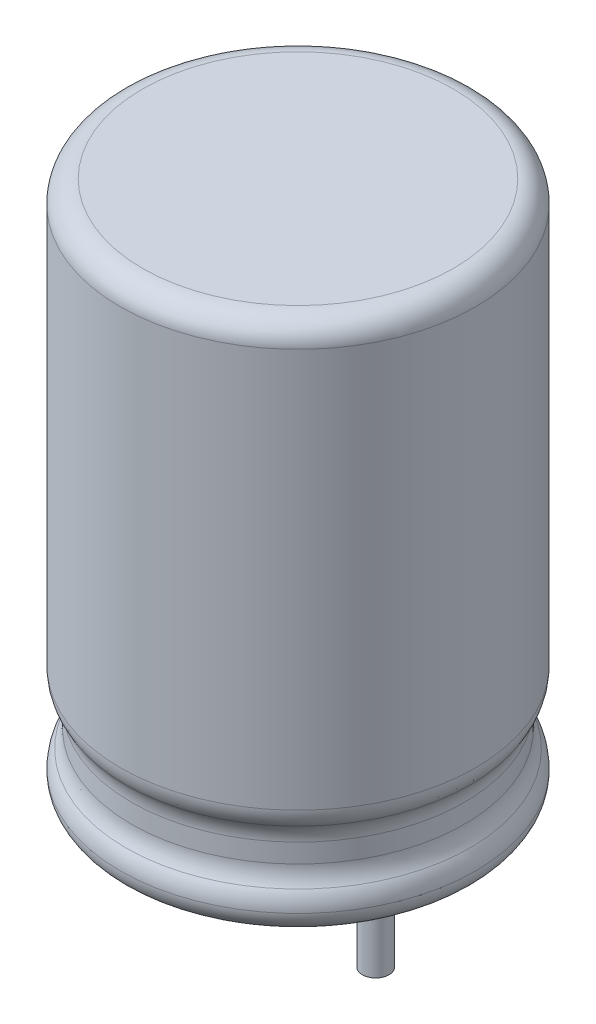
ISO-10303-21;
HEADER;
FILE_DESCRIPTION(('STEP AP214'),'2;1');
FILE_NAME('part.step','',(''),(''),'','','');
FILE_SCHEMA(('AUTOMOTIVE_DESIGN { 1 0 10303 214 1 1 1 1 }'));
ENDSEC;
DATA;
#1=APPLICATION_CONTEXT('core data for automotive mechanical design processes');
#2=APPLICATION_PROTOCOL_DEFINITION('international standard','automotive_design',2000,#1);
#3=PRODUCT_CONTEXT('',#1,'mechanical');
#4=PRODUCT('Part','Part','',(#3));
#5=PRODUCT_RELATED_PRODUCT_CATEGORY('part','',(#4));
#6=PRODUCT_DEFINITION_FORMATION('','',#4);
#7=PRODUCT_DEFINITION_CONTEXT('part definition',#1,'design');
#8=PRODUCT_DEFINITION('design','',#6,#7);
#9=PRODUCT_DEFINITION_SHAPE('','',#8);
#10=(LENGTH_UNIT() NAMED_UNIT(*) SI_UNIT(.MILLI.,.METRE.));
#11=(NAMED_UNIT(*) PLANE_ANGLE_UNIT() SI_UNIT($,.RADIAN.));
#12=(NAMED_UNIT(*) SI_UNIT($,.STERADIAN.) SOLID_ANGLE_UNIT());
#13=UNCERTAINTY_MEASURE_WITH_UNIT(LENGTH_MEASURE(1.E-05),#10,'distance_accuracy_value','');
#14=(GEOMETRIC_REPRESENTATION_CONTEXT(3) GLOBAL_UNCERTAINTY_ASSIGNED_CONTEXT((#13)) GLOBAL_UNIT_ASSIGNED_CONTEXT((#10,
#11,#12)) REPRESENTATION_CONTEXT('',''));
#15=CARTESIAN_POINT('',(0.,0.,0.));
#16=DIRECTION('',(0.,0.,1.));
#17=DIRECTION('',(1.,0.,0.));
#18=AXIS2_PLACEMENT_3D('',#15,#16,#17);
#19=CARTESIAN_POINT('',(0.,0.,0.));
#20=DIRECTION('',(0.,1.,0.));
#21=DIRECTION('',(0.,0.,1.));
#22=AXIS2_PLACEMENT_3D('',#19,#20,#21);
#23=PLANE('',#22);
#24=CARTESIAN_POINT('',(-1.75,0.,0.));
#25=DIRECTION('',(0.,1.,0.));
#26=DIRECTION('',(0.,0.,1.));
#27=AXIS2_PLACEMENT_3D('',#24,#25,#26);
#28=CIRCLE('',#27,0.3);
#29=CARTESIAN_POINT('',(-1.75,0.,0.3));
#30=VERTEX_POINT('',#29);
#31=EDGE_CURVE('E47',#30,#30,#28,.F.);
#32=ORIENTED_EDGE('',*,*,#31,.F.);
#33=EDGE_LOOP('',(#32));
#34=FACE_BOUND('',#33,.T.);
#35=CARTESIAN_POINT('',(0.,0.,0.));
#36=DIRECTION('',(0.,1.,0.));
#37=DIRECTION('',(0.,0.,1.));
#38=AXIS2_PLACEMENT_3D('',#35,#36,#37);
#39=CIRCLE('',#38,3.5);
#40=CARTESIAN_POINT('',(0.,0.,3.5));
#41=VERTEX_POINT('',#40);
#42=EDGE_CURVE('E193',#41,#41,#39,.F.);
#43=ORIENTED_EDGE('',*,*,#42,.T.);
#44=EDGE_LOOP('',(#43));
#45=FACE_BOUND('',#44,.T.);
#46=CARTESIAN_POINT('',(1.75,0.,0.));
#47=DIRECTION('',(0.,1.,0.));
#48=DIRECTION('',(0.,0.,1.));
#49=AXIS2_PLACEMENT_3D('',#46,#47,#48);
#50=CIRCLE('',#49,0.3);
#51=CARTESIAN_POINT('',(1.75,0.,0.300000000000001));
#52=VERTEX_POINT('',#51);
#53=EDGE_CURVE('E11',#52,#52,#50,.F.);
#54=ORIENTED_EDGE('',*,*,#53,.F.);
#55=EDGE_LOOP('',(#54));
#56=FACE_BOUND('',#55,.T.);
#57=ADVANCED_FACE('F38',(#34,#45,#56),#23,.F.);
#58=CARTESIAN_POINT('',(0.,12.,0.));
#59=DIRECTION('',(0.,-1.,0.));
#60=DIRECTION('',(0.,0.,-1.));
#61=AXIS2_PLACEMENT_3D('',#58,#59,#60);
#62=CYLINDRICAL_SURFACE('',#61,4.);
#63=CARTESIAN_POINT('',(0.,2.51224570639538,0.));
#64=DIRECTION('',(0.,-1.,0.));
#65=DIRECTION('',(0.,0.,-1.));
#66=AXIS2_PLACEMENT_3D('',#63,#64,#65);
#67=CIRCLE('',#66,4.);
#68=CARTESIAN_POINT('',(0.,2.51224570639538,-4.));
#69=VERTEX_POINT('',#68);
#70=EDGE_CURVE('E205',#69,#69,#67,.F.);
#71=ORIENTED_EDGE('',*,*,#70,.T.);
#72=EDGE_LOOP('',(#71));
#73=FACE_BOUND('',#72,.T.);
#74=CARTESIAN_POINT('',(0.,11.5,0.));
#75=DIRECTION('',(0.,1.,0.));
#76=DIRECTION('',(0.,0.,1.));
#77=AXIS2_PLACEMENT_3D('',#74,#75,#76);
#78=CIRCLE('',#77,4.);
#79=CARTESIAN_POINT('',(0.,11.5,4.));
#80=VERTEX_POINT('',#79);
#81=EDGE_CURVE('E186',#80,#80,#78,.F.);
#82=ORIENTED_EDGE('',*,*,#81,.T.);
#83=EDGE_LOOP('',(#82));
#84=FACE_BOUND('',#83,.T.);
#85=ADVANCED_FACE('F222',(#73,#84),#62,.T.);
#86=CARTESIAN_POINT('',(0.,12.,0.));
#87=DIRECTION('',(0.,1.,0.));
#88=DIRECTION('',(0.,0.,1.));
#89=AXIS2_PLACEMENT_3D('',#86,#87,#88);
#90=PLANE('',#89);
#91=CARTESIAN_POINT('',(0.,12.,0.));
#92=DIRECTION('',(0.,1.,0.));
#93=DIRECTION('',(0.,0.,1.));
#94=AXIS2_PLACEMENT_3D('',#91,#92,#93);
#95=CIRCLE('',#94,3.5);
#96=CARTESIAN_POINT('',(0.,12.,3.5));
#97=VERTEX_POINT('',#96);
#98=EDGE_CURVE('E196',#97,#97,#95,.T.);
#99=ORIENTED_EDGE('',*,*,#98,.T.);
#100=EDGE_LOOP('',(#99));
#101=FACE_BOUND('',#100,.T.);
#102=ADVANCED_FACE('F288',(#101),#90,.T.);
#103=CARTESIAN_POINT('',(0.,11.5,0.));
#104=DIRECTION('',(0.,1.,0.));
#105=DIRECTION('',(0.,0.,1.));
#106=AXIS2_PLACEMENT_3D('',#103,#104,#105);
#107=TOROIDAL_SURFACE('',#106,3.5,0.5);
#108=ORIENTED_EDGE('',*,*,#81,.F.);
#109=EDGE_LOOP('',(#108));
#110=FACE_BOUND('',#109,.T.);
#111=ORIENTED_EDGE('',*,*,#98,.F.);
#112=EDGE_LOOP('',(#111));
#113=FACE_BOUND('',#112,.T.);
#114=ADVANCED_FACE('F286',(#110,#113),#107,.T.);
#115=CARTESIAN_POINT('',(0.,0.75,0.));
#116=DIRECTION('',(0.,1.,0.));
#117=DIRECTION('',(0.,0.,1.));
#118=AXIS2_PLACEMENT_3D('',#115,#116,#117);
#119=CYLINDRICAL_SURFACE('',#118,3.75);
#120=CARTESIAN_POINT('',(0.,1.28619026473818,0.));
#121=DIRECTION('',(0.,-1.,0.));
#122=DIRECTION('',(0.,0.,-1.));
#123=AXIS2_PLACEMENT_3D('',#120,#121,#122);
#124=CIRCLE('',#123,3.75);
#125=CARTESIAN_POINT('',(0.,1.28619026473818,-3.75));
#126=VERTEX_POINT('',#125);
#127=EDGE_CURVE('E202',#126,#126,#124,.F.);
#128=ORIENTED_EDGE('',*,*,#127,.T.);
#129=EDGE_LOOP('',(#128));
#130=FACE_BOUND('',#129,.T.);
#131=CARTESIAN_POINT('',(0.,1.71380973526182,0.));
#132=DIRECTION('',(0.,1.,0.));
#133=DIRECTION('',(0.,0.,1.));
#134=AXIS2_PLACEMENT_3D('',#131,#132,#133);
#135=CIRCLE('',#134,3.75);
#136=CARTESIAN_POINT('',(0.,1.71380973526182,3.75));
#137=VERTEX_POINT('',#136);
#138=EDGE_CURVE('E199',#137,#137,#135,.F.);
#139=ORIENTED_EDGE('',*,*,#138,.T.);
#140=EDGE_LOOP('',(#139));
#141=FACE_BOUND('',#140,.T.);
#142=ADVANCED_FACE('F282',(#130,#141),#119,.T.);
#143=CARTESIAN_POINT('',(0.,0.5,0.));
#144=DIRECTION('',(0.,1.,0.));
#145=DIRECTION('',(0.,0.,1.));
#146=AXIS2_PLACEMENT_3D('',#143,#144,#145);
#147=TOROIDAL_SURFACE('',#146,3.5,0.5);
#148=ORIENTED_EDGE('',*,*,#42,.F.);
#149=EDGE_LOOP('',(#148));
#150=FACE_BOUND('',#149,.T.);
#151=CARTESIAN_POINT('',(0.,0.5,0.));
#152=DIRECTION('',(0.,1.,0.));
#153=DIRECTION('',(0.,0.,1.));
#154=AXIS2_PLACEMENT_3D('',#151,#152,#153);
#155=CIRCLE('',#154,4.);
#156=CARTESIAN_POINT('',(0.,0.5,4.));
#157=VERTEX_POINT('',#156);
#158=EDGE_CURVE('E190',#157,#157,#155,.T.);
#159=ORIENTED_EDGE('',*,*,#158,.F.);
#160=EDGE_LOOP('',(#159));
#161=FACE_BOUND('',#160,.T.);
#162=ADVANCED_FACE('F285',(#150,#161),#147,.T.);
#163=CARTESIAN_POINT('',(0.,1.28619026473818,0.));
#164=DIRECTION('',(0.,-1.,0.));
#165=DIRECTION('',(0.,0.,-1.));
#166=AXIS2_PLACEMENT_3D('',#163,#164,#165);
#167=TOROIDAL_SURFACE('',#166,4.45,0.7);
#168=CARTESIAN_POINT('',(0.,0.886893139820485,0.));
#169=DIRECTION('',(0.,1.,0.));
#170=DIRECTION('',(0.,0.,1.));
#171=AXIS2_PLACEMENT_3D('',#168,#169,#170);
#172=CIRCLE('',#171,3.87505495390215);
#173=CARTESIAN_POINT('',(0.,0.886893139820485,3.87505495390215));
#174=VERTEX_POINT('',#173);
#175=EDGE_CURVE('E211',#174,#174,#172,.T.);
#176=ORIENTED_EDGE('',*,*,#175,.T.);
#177=EDGE_LOOP('',(#176));
#178=FACE_BOUND('',#177,.T.);
#179=ORIENTED_EDGE('',*,*,#127,.F.);
#180=EDGE_LOOP('',(#179));
#181=FACE_BOUND('',#180,.T.);
#182=ADVANCED_FACE('F297',(#178,#181),#167,.F.);
#183=CARTESIAN_POINT('',(0.,1.71380973526182,0.));
#184=DIRECTION('',(0.,1.,0.));
#185=DIRECTION('',(0.,0.,1.));
#186=AXIS2_PLACEMENT_3D('',#183,#184,#185);
#187=TOROIDAL_SURFACE('',#186,4.45,0.7);
#188=CARTESIAN_POINT('',(0.,2.1130277208286,0.));
#189=DIRECTION('',(0.,-1.,0.));
#190=DIRECTION('',(0.,0.,-1.));
#191=AXIS2_PLACEMENT_3D('',#188,#189,#190);
#192=CIRCLE('',#191,3.87499999999999);
#193=CARTESIAN_POINT('',(0.,2.1130277208286,-3.87499999999999));
#194=VERTEX_POINT('',#193);
#195=EDGE_CURVE('E208',#194,#194,#192,.T.);
#196=ORIENTED_EDGE('',*,*,#195,.T.);
#197=EDGE_LOOP('',(#196));
#198=FACE_BOUND('',#197,.T.);
#199=ORIENTED_EDGE('',*,*,#138,.F.);
#200=EDGE_LOOP('',(#199));
#201=FACE_BOUND('',#200,.T.);
#202=ADVANCED_FACE('F304',(#198,#201),#187,.F.);
#203=CARTESIAN_POINT('',(0.,2.51224570639538,0.));
#204=DIRECTION('',(0.,-1.,0.));
#205=DIRECTION('',(0.,0.,-1.));
#206=AXIS2_PLACEMENT_3D('',#203,#204,#205);
#207=TOROIDAL_SURFACE('',#206,3.3,0.7);
#208=ORIENTED_EDGE('',*,*,#195,.F.);
#209=EDGE_LOOP('',(#208));
#210=FACE_BOUND('',#209,.T.);
#211=ORIENTED_EDGE('',*,*,#70,.F.);
#212=EDGE_LOOP('',(#211));
#213=FACE_BOUND('',#212,.T.);
#214=ADVANCED_FACE('F307',(#210,#213),#207,.T.);
#215=CARTESIAN_POINT('',(0.,0.487596014902783,0.));
#216=DIRECTION('',(0.,1.,0.));
#217=DIRECTION('',(0.,0.,1.));
#218=AXIS2_PLACEMENT_3D('',#215,#216,#217);
#219=TOROIDAL_SURFACE('',#218,3.3001099078043,0.7);
#220=ORIENTED_EDGE('',*,*,#158,.T.);
#221=EDGE_LOOP('',(#220));
#222=FACE_BOUND('',#221,.T.);
#223=ORIENTED_EDGE('',*,*,#175,.F.);
#224=EDGE_LOOP('',(#223));
#225=FACE_BOUND('',#224,.T.);
#226=ADVANCED_FACE('F40',(#222,#225),#219,.T.);
#227=CARTESIAN_POINT('',(-1.75,-2.5,0.));
#228=DIRECTION('',(0.,1.,0.));
#229=DIRECTION('',(0.,0.,1.));
#230=AXIS2_PLACEMENT_3D('',#227,#228,#229);
#231=CYLINDRICAL_SURFACE('',#230,0.3);
#232=CARTESIAN_POINT('',(-1.75,-2.5,0.));
#233=DIRECTION('',(0.,-1.,0.));
#234=DIRECTION('',(0.,0.,-1.));
#235=AXIS2_PLACEMENT_3D('',#232,#233,#234);
#236=CIRCLE('',#235,0.3);
#237=CARTESIAN_POINT('',(-1.75,-2.5,-0.3));
#238=VERTEX_POINT('',#237);
#239=EDGE_CURVE('E139',#238,#238,#236,.T.);
#240=ORIENTED_EDGE('',*,*,#239,.F.);
#241=EDGE_LOOP('',(#240));
#242=FACE_BOUND('',#241,.T.);
#243=ORIENTED_EDGE('',*,*,#31,.T.);
#244=EDGE_LOOP('',(#243));
#245=FACE_BOUND('',#244,.T.);
#246=ADVANCED_FACE('F218',(#242,#245),#231,.T.);
#247=CARTESIAN_POINT('',(-1.75,-2.5,0.));
#248=DIRECTION('',(0.,-1.,0.));
#249=DIRECTION('',(0.,0.,-1.));
#250=AXIS2_PLACEMENT_3D('',#247,#248,#249);
#251=PLANE('',#250);
#252=ORIENTED_EDGE('',*,*,#239,.T.);
#253=EDGE_LOOP('',(#252));
#254=FACE_BOUND('',#253,.T.);
#255=ADVANCED_FACE('F231',(#254),#251,.T.);
#256=CARTESIAN_POINT('',(1.75,-2.5,0.));
#257=DIRECTION('',(0.,1.,0.));
#258=DIRECTION('',(0.,0.,1.));
#259=AXIS2_PLACEMENT_3D('',#256,#257,#258);
#260=CYLINDRICAL_SURFACE('',#259,0.3);
#261=CARTESIAN_POINT('',(1.75,-2.5,0.));
#262=DIRECTION('',(0.,-1.,0.));
#263=DIRECTION('',(0.,0.,-1.));
#264=AXIS2_PLACEMENT_3D('',#261,#262,#263);
#265=CIRCLE('',#264,0.3);
#266=CARTESIAN_POINT('',(1.75,-2.5,-0.3));
#267=VERTEX_POINT('',#266);
#268=EDGE_CURVE('E515',#267,#267,#265,.T.);
#269=ORIENTED_EDGE('',*,*,#268,.F.);
#270=EDGE_LOOP('',(#269));
#271=FACE_BOUND('',#270,.T.);
#272=ORIENTED_EDGE('',*,*,#53,.T.);
#273=EDGE_LOOP('',(#272));
#274=FACE_BOUND('',#273,.T.);
#275=ADVANCED_FACE('F228',(#271,#274),#260,.T.);
#276=CARTESIAN_POINT('',(1.75,-2.5,0.));
#277=DIRECTION('',(0.,-1.,0.));
#278=DIRECTION('',(0.,0.,-1.));
#279=AXIS2_PLACEMENT_3D('',#276,#277,#278);
#280=PLANE('',#279);
#281=ORIENTED_EDGE('',*,*,#268,.T.);
#282=EDGE_LOOP('',(#281));
#283=FACE_BOUND('',#282,.T.);
#284=ADVANCED_FACE('F230',(#283),#280,.T.);
#285=CLOSED_SHELL('',(#57,#85,#102,#114,#142,#162,#182,#202,#214,#226,#246,#255,#275,#284));
#286=CARTESIAN_POINT('',(0.,11.9,0.));
#287=DIRECTION('',(0.,1.,0.));
#288=DIRECTION('',(0.,0.,1.));
#289=AXIS2_PLACEMENT_3D('',#286,#287,#288);
#290=PLANE('',#289);
#291=DIRECTION('',(0.72638071356326,0.,-0.687292557040545));
#292=VECTOR('',#291,1.);
#293=CARTESIAN_POINT('',(-1.83797344550552,11.9,-1.75772085770653));
#294=LINE('',#293,#292);
#295=CARTESIAN_POINT('',(-1.83797344550552,11.9,-1.75772085770653));
#296=VERTEX_POINT('',#295);
#297=CARTESIAN_POINT('',(-1.65347274426045,11.9,-1.93229316719483));
#298=VERTEX_POINT('',#297);
#299=EDGE_CURVE('E182',#296,#298,#294,.T.);
#300=ORIENTED_EDGE('',*,*,#299,.T.);
#301=DIRECTION('',(-0.687292557040545,0.,-0.726380713563259));
#302=VECTOR('',#301,1.);
#303=CARTESIAN_POINT('',(0.0922503506225339,11.9,-0.0872861547441492));
#304=LINE('',#303,#302);
#305=CARTESIAN_POINT('',(0.0418556656844723,11.9,-0.140546919508906));
#306=VERTEX_POINT('',#305);
#307=EDGE_CURVE('E54',#306,#298,#304,.T.);
#308=ORIENTED_EDGE('',*,*,#307,.F.);
#309=DIRECTION('',(0.972710429285124,0.,-0.232022457447443));
#310=VECTOR('',#309,1.);
#311=CARTESIAN_POINT('',(-0.0294668520958253,11.9,-0.123534224519211));
#312=LINE('',#311,#310);
#313=CARTESIAN_POINT('',(2.44121763828839,11.9,-0.712871266435717));
#314=VERTEX_POINT('',#313);
#315=EDGE_CURVE('E156',#306,#314,#312,.T.);
#316=ORIENTED_EDGE('',*,*,#315,.T.);
#317=DIRECTION('',(0.232022457447444,0.,0.972710429285123));
#318=VECTOR('',#317,1.);
#319=CARTESIAN_POINT('',(2.44121763828839,11.9,-0.712871266435717));
#320=LINE('',#319,#318);
#321=CARTESIAN_POINT('',(2.50015134248004,11.9,-0.465802817397295));
#322=VERTEX_POINT('',#321);
#323=EDGE_CURVE('E163',#314,#322,#320,.T.);
#324=ORIENTED_EDGE('',*,*,#323,.T.);
#325=DIRECTION('',(0.972710429285124,0.,-0.232022457447443));
#326=VECTOR('',#325,1.);
#327=CARTESIAN_POINT('',(0.0294668520958253,11.9,0.123534224519211));
#328=LINE('',#327,#326);
#329=CARTESIAN_POINT('',(0.100789369876124,11.9,0.106521529529515));
#330=VERTEX_POINT('',#329);
#331=EDGE_CURVE('E152',#330,#322,#328,.T.);
#332=ORIENTED_EDGE('',*,*,#331,.F.);
#333=DIRECTION('',(-0.285417872244573,0.,0.958403171010708));
#334=VECTOR('',#333,1.);
#335=CARTESIAN_POINT('',(0.12171720271836,11.9,0.0362480697750608));
#336=LINE('',#335,#334);
#337=CARTESIAN_POINT('',(-0.603244192782856,11.9,2.47059212414226));
#338=VERTEX_POINT('',#337);
#339=EDGE_CURVE('E144',#330,#338,#336,.T.);
#340=ORIENTED_EDGE('',*,*,#339,.T.);
#341=DIRECTION('',(-0.958403171010708,0.,-0.285417872244573));
#342=VECTOR('',#341,1.);
#343=CARTESIAN_POINT('',(-0.603244192782856,11.9,2.47059212414226));
#344=LINE('',#343,#342);
#345=CARTESIAN_POINT('',(-0.846678598219576,11.9,2.39809598459214));
#346=VERTEX_POINT('',#345);
#347=EDGE_CURVE('E125',#338,#346,#344,.T.);
#348=ORIENTED_EDGE('',*,*,#347,.T.);
#349=DIRECTION('',(-0.285417872244573,0.,0.958403171010708));
#350=VECTOR('',#349,1.);
#351=CARTESIAN_POINT('',(-0.12171720271836,11.9,-0.0362480697750608));
#352=LINE('',#351,#350);
#353=CARTESIAN_POINT('',(-0.142645035560596,11.9,0.0340253899793922));
#354=VERTEX_POINT('',#353);
#355=EDGE_CURVE('E134',#354,#346,#352,.T.);
#356=ORIENTED_EDGE('',*,*,#355,.F.);
#357=DIRECTION('',(-0.687292557040545,0.,-0.726380713563259));
#358=VECTOR('',#357,1.);
#359=CARTESIAN_POINT('',(-0.0922503506225339,11.9,0.0872861547441492));
#360=LINE('',#359,#358);
#361=EDGE_CURVE('E176',#354,#296,#360,.T.);
#362=ORIENTED_EDGE('',*,*,#361,.T.);
#363=EDGE_LOOP('',(#300,#308,#316,#324,#332,#340,#348,#356,#362));
#364=FACE_BOUND('',#363,.T.);
#365=ADVANCED_FACE('F142',(#364),#290,.F.);
#366=CARTESIAN_POINT('',(0.0922503506225339,11.8,-0.0872861547441492));
#367=DIRECTION('',(0.,1.,0.));
#368=DIRECTION('',(0.,0.,1.));
#369=AXIS2_PLACEMENT_3D('',#366,#367,#368);
#370=PLANE('',#369);
#371=DIRECTION('',(-0.687292557040545,0.,-0.726380713563259));
#372=VECTOR('',#371,1.);
#373=CARTESIAN_POINT('',(-0.0922503506225339,11.8,0.0872861547441492));
#374=LINE('',#373,#372);
#375=CARTESIAN_POINT('',(-0.142645035560596,11.8,0.0340253899793922));
#376=VERTEX_POINT('',#375);
#377=CARTESIAN_POINT('',(-1.83797344550552,11.8,-1.75772085770653));
#378=VERTEX_POINT('',#377);
#379=EDGE_CURVE('E63',#376,#378,#374,.T.);
#380=ORIENTED_EDGE('',*,*,#379,.F.);
#381=DIRECTION('',(-0.285417872244573,0.,0.958403171010708));
#382=VECTOR('',#381,1.);
#383=CARTESIAN_POINT('',(-0.12171720271836,11.8,-0.0362480697750608));
#384=LINE('',#383,#382);
#385=CARTESIAN_POINT('',(-0.846678598219576,11.8,2.39809598459214));
#386=VERTEX_POINT('',#385);
#387=EDGE_CURVE('E146',#376,#386,#384,.T.);
#388=ORIENTED_EDGE('',*,*,#387,.T.);
#389=DIRECTION('',(-0.958403171010708,0.,-0.285417872244573));
#390=VECTOR('',#389,1.);
#391=CARTESIAN_POINT('',(-0.603244192782856,11.8,2.47059212414226));
#392=LINE('',#391,#390);
#393=CARTESIAN_POINT('',(-0.603244192782856,11.8,2.47059212414226));
#394=VERTEX_POINT('',#393);
#395=EDGE_CURVE('E128',#394,#386,#392,.T.);
#396=ORIENTED_EDGE('',*,*,#395,.F.);
#397=DIRECTION('',(-0.285417872244573,0.,0.958403171010708));
#398=VECTOR('',#397,1.);
#399=CARTESIAN_POINT('',(0.12171720271836,11.8,0.0362480697750608));
#400=LINE('',#399,#398);
#401=CARTESIAN_POINT('',(0.100789369876124,11.8,0.106521529529515));
#402=VERTEX_POINT('',#401);
#403=EDGE_CURVE('E131',#402,#394,#400,.T.);
#404=ORIENTED_EDGE('',*,*,#403,.F.);
#405=DIRECTION('',(0.972710429285124,0.,-0.232022457447443));
#406=VECTOR('',#405,1.);
#407=CARTESIAN_POINT('',(0.0294668520958253,11.8,0.123534224519211));
#408=LINE('',#407,#406);
#409=CARTESIAN_POINT('',(2.50015134248004,11.8,-0.465802817397295));
#410=VERTEX_POINT('',#409);
#411=EDGE_CURVE('E153',#402,#410,#408,.T.);
#412=ORIENTED_EDGE('',*,*,#411,.T.);
#413=DIRECTION('',(0.232022457447444,0.,0.972710429285123));
#414=VECTOR('',#413,1.);
#415=CARTESIAN_POINT('',(2.44121763828839,11.8,-0.712871266435717));
#416=LINE('',#415,#414);
#417=CARTESIAN_POINT('',(2.44121763828839,11.8,-0.712871266435717));
#418=VERTEX_POINT('',#417);
#419=EDGE_CURVE('E155',#418,#410,#416,.T.);
#420=ORIENTED_EDGE('',*,*,#419,.F.);
#421=DIRECTION('',(0.972710429285124,0.,-0.232022457447443));
#422=VECTOR('',#421,1.);
#423=CARTESIAN_POINT('',(-0.0294668520958253,11.8,-0.123534224519211));
#424=LINE('',#423,#422);
#425=CARTESIAN_POINT('',(0.0418556656844723,11.8,-0.140546919508906));
#426=VERTEX_POINT('',#425);
#427=EDGE_CURVE('E159',#426,#418,#424,.T.);
#428=ORIENTED_EDGE('',*,*,#427,.F.);
#429=DIRECTION('',(-0.687292557040545,0.,-0.726380713563259));
#430=VECTOR('',#429,1.);
#431=CARTESIAN_POINT('',(0.0922503506225339,11.8,-0.0872861547441492));
#432=LINE('',#431,#430);
#433=CARTESIAN_POINT('',(-1.65347274426045,11.8,-1.93229316719483));
#434=VERTEX_POINT('',#433);
#435=EDGE_CURVE('E173',#426,#434,#432,.T.);
#436=ORIENTED_EDGE('',*,*,#435,.T.);
#437=DIRECTION('',(0.72638071356326,0.,-0.687292557040545));
#438=VECTOR('',#437,1.);
#439=CARTESIAN_POINT('',(-1.83797344550552,11.8,-1.75772085770653));
#440=LINE('',#439,#438);
#441=EDGE_CURVE('E175',#378,#434,#440,.T.);
#442=ORIENTED_EDGE('',*,*,#441,.F.);
#443=EDGE_LOOP('',(#380,#388,#396,#404,#412,#420,#428,#436,#442));
#444=FACE_BOUND('',#443,.T.);
#445=ADVANCED_FACE('F271',(#444),#370,.T.);
#446=CARTESIAN_POINT('',(-1.83797344550552,11.8,-1.75772085770653));
#447=DIRECTION('',(0.687292557040544,0.,0.726380713563259));
#448=DIRECTION('',(0.726380713563259,0.,-0.687292557040544));
#449=AXIS2_PLACEMENT_3D('',#446,#447,#448);
#450=PLANE('',#449);
#451=ORIENTED_EDGE('',*,*,#299,.F.);
#452=DIRECTION('',(0.,1.,0.));
#453=VECTOR('',#452,1.);
#454=CARTESIAN_POINT('',(-1.83797344550552,11.8,-1.75772085770653));
#455=LINE('',#454,#453);
#456=EDGE_CURVE('E71',#378,#296,#455,.T.);
#457=ORIENTED_EDGE('',*,*,#456,.F.);
#458=ORIENTED_EDGE('',*,*,#441,.T.);
#459=DIRECTION('',(0.,1.,0.));
#460=VECTOR('',#459,1.);
#461=CARTESIAN_POINT('',(-1.65347274426045,11.8,-1.93229316719483));
#462=LINE('',#461,#460);
#463=EDGE_CURVE('E180',#434,#298,#462,.T.);
#464=ORIENTED_EDGE('',*,*,#463,.T.);
#465=EDGE_LOOP('',(#451,#457,#458,#464));
#466=FACE_BOUND('',#465,.T.);
#467=ADVANCED_FACE('F256',(#466),#450,.T.);
#468=CARTESIAN_POINT('',(-0.603244192782856,11.8,2.47059212414226));
#469=DIRECTION('',(0.285417872244573,0.,-0.958403171010708));
#470=DIRECTION('',(-0.958403171010708,0.,-0.285417872244573));
#471=AXIS2_PLACEMENT_3D('',#468,#469,#470);
#472=PLANE('',#471);
#473=ORIENTED_EDGE('',*,*,#347,.F.);
#474=DIRECTION('',(0.,1.,0.));
#475=VECTOR('',#474,1.);
#476=CARTESIAN_POINT('',(-0.603244192782856,11.8,2.47059212414226));
#477=LINE('',#476,#475);
#478=EDGE_CURVE('E130',#394,#338,#477,.T.);
#479=ORIENTED_EDGE('',*,*,#478,.F.);
#480=ORIENTED_EDGE('',*,*,#395,.T.);
#481=DIRECTION('',(0.,1.,0.));
#482=VECTOR('',#481,1.);
#483=CARTESIAN_POINT('',(-0.846678598219576,11.8,2.39809598459214));
#484=LINE('',#483,#482);
#485=EDGE_CURVE('E120',#386,#346,#484,.T.);
#486=ORIENTED_EDGE('',*,*,#485,.T.);
#487=EDGE_LOOP('',(#473,#479,#480,#486));
#488=FACE_BOUND('',#487,.T.);
#489=ADVANCED_FACE('F122',(#488),#472,.T.);
#490=CARTESIAN_POINT('',(-0.12171720271836,11.8,-0.0362480697750608));
#491=DIRECTION('',(-0.958403171010708,0.,-0.285417872244573));
#492=DIRECTION('',(-0.285417872244573,0.,0.958403171010708));
#493=AXIS2_PLACEMENT_3D('',#490,#491,#492);
#494=PLANE('',#493);
#495=DIRECTION('',(0.,1.,0.));
#496=VECTOR('',#495,1.);
#497=CARTESIAN_POINT('',(-0.142645035560596,11.8,0.0340253899793922));
#498=LINE('',#497,#496);
#499=EDGE_CURVE('E136',#376,#354,#498,.T.);
#500=ORIENTED_EDGE('',*,*,#499,.T.);
#501=ORIENTED_EDGE('',*,*,#355,.T.);
#502=ORIENTED_EDGE('',*,*,#485,.F.);
#503=ORIENTED_EDGE('',*,*,#387,.F.);
#504=EDGE_LOOP('',(#500,#501,#502,#503));
#505=FACE_BOUND('',#504,.T.);
#506=ADVANCED_FACE('F135',(#505),#494,.F.);
#507=CARTESIAN_POINT('',(0.12171720271836,11.8,0.0362480697750608));
#508=DIRECTION('',(-0.958403171010708,0.,-0.285417872244573));
#509=DIRECTION('',(-0.285417872244573,0.,0.958403171010708));
#510=AXIS2_PLACEMENT_3D('',#507,#508,#509);
#511=PLANE('',#510);
#512=DIRECTION('',(0.,-1.,0.));
#513=VECTOR('',#512,1.);
#514=CARTESIAN_POINT('',(0.100789369876124,11.8,0.106521529529515));
#515=LINE('',#514,#513);
#516=EDGE_CURVE('E214',#330,#402,#515,.T.);
#517=ORIENTED_EDGE('',*,*,#516,.T.);
#518=ORIENTED_EDGE('',*,*,#403,.T.);
#519=ORIENTED_EDGE('',*,*,#478,.T.);
#520=ORIENTED_EDGE('',*,*,#339,.F.);
#521=EDGE_LOOP('',(#517,#518,#519,#520));
#522=FACE_BOUND('',#521,.T.);
#523=ADVANCED_FACE('F248',(#522),#511,.T.);
#524=CARTESIAN_POINT('',(-0.0922503506225339,11.8,0.0872861547441492));
#525=DIRECTION('',(0.726380713563259,0.,-0.687292557040545));
#526=DIRECTION('',(-0.687292557040545,0.,-0.726380713563259));
#527=AXIS2_PLACEMENT_3D('',#524,#525,#526);
#528=PLANE('',#527);
#529=ORIENTED_EDGE('',*,*,#499,.F.);
#530=ORIENTED_EDGE('',*,*,#379,.T.);
#531=ORIENTED_EDGE('',*,*,#456,.T.);
#532=ORIENTED_EDGE('',*,*,#361,.F.);
#533=EDGE_LOOP('',(#529,#530,#531,#532));
#534=FACE_BOUND('',#533,.T.);
#535=ADVANCED_FACE('F251',(#534),#528,.T.);
#536=CARTESIAN_POINT('',(2.44121763828839,11.8,-0.712871266435717));
#537=DIRECTION('',(-0.972710429285123,0.,0.232022457447444));
#538=DIRECTION('',(0.232022457447444,0.,0.972710429285123));
#539=AXIS2_PLACEMENT_3D('',#536,#537,#538);
#540=PLANE('',#539);
#541=ORIENTED_EDGE('',*,*,#323,.F.);
#542=DIRECTION('',(0.,1.,0.));
#543=VECTOR('',#542,1.);
#544=CARTESIAN_POINT('',(2.44121763828839,11.8,-0.712871266435717));
#545=LINE('',#544,#543);
#546=EDGE_CURVE('E168',#418,#314,#545,.T.);
#547=ORIENTED_EDGE('',*,*,#546,.F.);
#548=ORIENTED_EDGE('',*,*,#419,.T.);
#549=DIRECTION('',(0.,1.,0.));
#550=VECTOR('',#549,1.);
#551=CARTESIAN_POINT('',(2.50015134248004,11.8,-0.465802817397295));
#552=LINE('',#551,#550);
#553=EDGE_CURVE('E161',#410,#322,#552,.T.);
#554=ORIENTED_EDGE('',*,*,#553,.T.);
#555=EDGE_LOOP('',(#541,#547,#548,#554));
#556=FACE_BOUND('',#555,.T.);
#557=ADVANCED_FACE('F263',(#556),#540,.T.);
#558=CARTESIAN_POINT('',(-0.0294668520958253,11.8,-0.123534224519211));
#559=DIRECTION('',(0.232022457447443,0.,0.972710429285124));
#560=DIRECTION('',(0.972710429285124,0.,-0.232022457447443));
#561=AXIS2_PLACEMENT_3D('',#558,#559,#560);
#562=PLANE('',#561);
#563=DIRECTION('',(0.,-1.,0.));
#564=VECTOR('',#563,1.);
#565=CARTESIAN_POINT('',(0.0418556656844723,11.8,-0.140546919508906));
#566=LINE('',#565,#564);
#567=EDGE_CURVE('E78',#306,#426,#566,.T.);
#568=ORIENTED_EDGE('',*,*,#567,.T.);
#569=ORIENTED_EDGE('',*,*,#427,.T.);
#570=ORIENTED_EDGE('',*,*,#546,.T.);
#571=ORIENTED_EDGE('',*,*,#315,.F.);
#572=EDGE_LOOP('',(#568,#569,#570,#571));
#573=FACE_BOUND('',#572,.T.);
#574=ADVANCED_FACE('F259',(#573),#562,.T.);
#575=CARTESIAN_POINT('',(0.0922503506225339,11.8,-0.0872861547441492));
#576=DIRECTION('',(0.726380713563259,0.,-0.687292557040545));
#577=DIRECTION('',(-0.687292557040545,0.,-0.726380713563259));
#578=AXIS2_PLACEMENT_3D('',#575,#576,#577);
#579=PLANE('',#578);
#580=ORIENTED_EDGE('',*,*,#567,.F.);
#581=ORIENTED_EDGE('',*,*,#307,.T.);
#582=ORIENTED_EDGE('',*,*,#463,.F.);
#583=ORIENTED_EDGE('',*,*,#435,.F.);
#584=EDGE_LOOP('',(#580,#581,#582,#583));
#585=FACE_BOUND('',#584,.T.);
#586=ADVANCED_FACE('F262',(#585),#579,.F.);
#587=CARTESIAN_POINT('',(0.0294668520958253,11.8,0.123534224519211));
#588=DIRECTION('',(0.232022457447443,0.,0.972710429285124));
#589=DIRECTION('',(0.972710429285124,0.,-0.232022457447443));
#590=AXIS2_PLACEMENT_3D('',#587,#588,#589);
#591=PLANE('',#590);
#592=ORIENTED_EDGE('',*,*,#516,.F.);
#593=ORIENTED_EDGE('',*,*,#331,.T.);
#594=ORIENTED_EDGE('',*,*,#553,.F.);
#595=ORIENTED_EDGE('',*,*,#411,.F.);
#596=EDGE_LOOP('',(#592,#593,#594,#595));
#597=FACE_BOUND('',#596,.T.);
#598=ADVANCED_FACE('F267',(#597),#591,.F.);
#599=CLOSED_SHELL('',(#365,#445,#467,#489,#506,#523,#535,#557,#574,#586,#598));
#600=ORIENTED_CLOSED_SHELL('',*,#285,.T.);
#601=BREP_WITH_VOIDS('B2',#599,(#600));
#602=ADVANCED_BREP_SHAPE_REPRESENTATION('',(#18,#601),#14);
#603=SHAPE_DEFINITION_REPRESENTATION(#9,#602);
ENDSEC;
END-ISO-10303-21;
